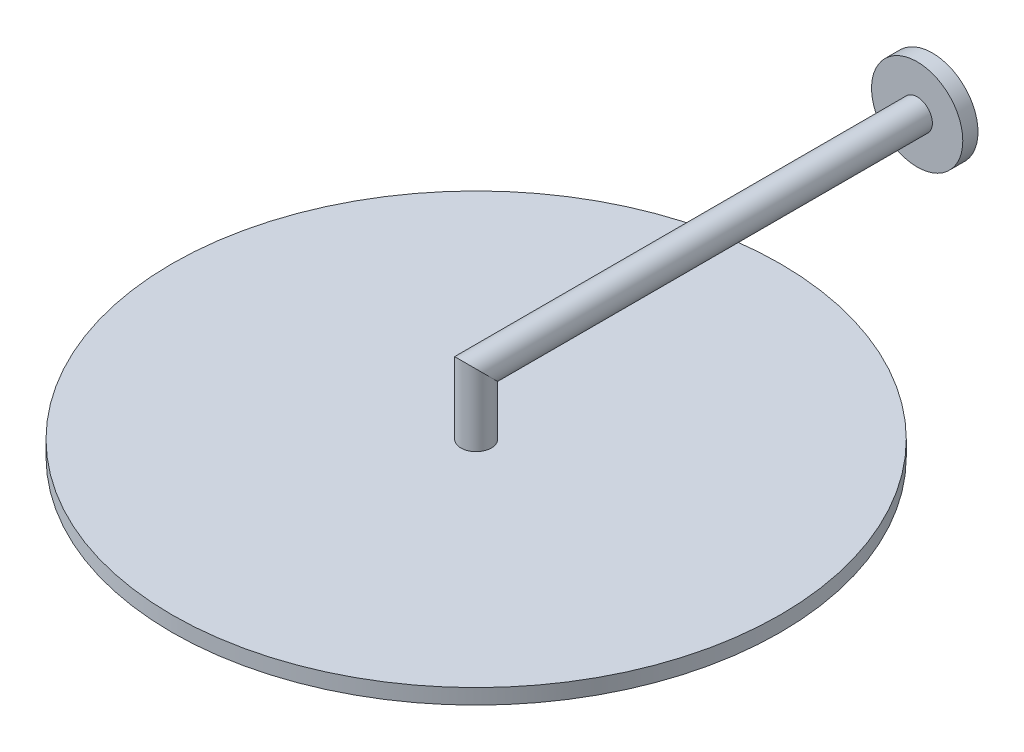
ISO-10303-21;
HEADER;
FILE_DESCRIPTION(('STEP AP214'),'2;1');
FILE_NAME('part.step','',(''),(''),'','','');
FILE_SCHEMA(('AUTOMOTIVE_DESIGN { 1 0 10303 214 1 1 1 1 }'));
ENDSEC;
DATA;
#1=APPLICATION_CONTEXT('core data for automotive mechanical design processes');
#2=APPLICATION_PROTOCOL_DEFINITION('international standard','automotive_design',2000,#1);
#3=PRODUCT_CONTEXT('',#1,'mechanical');
#4=PRODUCT('Part','Part','',(#3));
#5=PRODUCT_RELATED_PRODUCT_CATEGORY('part','',(#4));
#6=PRODUCT_DEFINITION_FORMATION('','',#4);
#7=PRODUCT_DEFINITION_CONTEXT('part definition',#1,'design');
#8=PRODUCT_DEFINITION('design','',#6,#7);
#9=PRODUCT_DEFINITION_SHAPE('','',#8);
#10=(LENGTH_UNIT() NAMED_UNIT(*) SI_UNIT(.MILLI.,.METRE.));
#11=(NAMED_UNIT(*) PLANE_ANGLE_UNIT() SI_UNIT($,.RADIAN.));
#12=(NAMED_UNIT(*) SI_UNIT($,.STERADIAN.) SOLID_ANGLE_UNIT());
#13=UNCERTAINTY_MEASURE_WITH_UNIT(LENGTH_MEASURE(1.E-05),#10,'distance_accuracy_value','');
#14=(GEOMETRIC_REPRESENTATION_CONTEXT(3) GLOBAL_UNCERTAINTY_ASSIGNED_CONTEXT((#13)) GLOBAL_UNIT_ASSIGNED_CONTEXT((#10,
#11,#12)) REPRESENTATION_CONTEXT('',''));
#15=CARTESIAN_POINT('',(0.,0.,0.));
#16=DIRECTION('',(0.,0.,1.));
#17=DIRECTION('',(1.,0.,0.));
#18=AXIS2_PLACEMENT_3D('',#15,#16,#17);
#19=CARTESIAN_POINT('',(0.,0.,10.));
#20=DIRECTION('',(0.,0.,-1.));
#21=DIRECTION('',(-1.,0.,0.));
#22=AXIS2_PLACEMENT_3D('',#19,#20,#21);
#23=CYLINDRICAL_SURFACE('',#22,30.);
#24=CARTESIAN_POINT('',(0.,0.,10.));
#25=DIRECTION('',(0.,0.,1.));
#26=DIRECTION('',(1.,0.,0.));
#27=AXIS2_PLACEMENT_3D('',#24,#25,#26);
#28=CIRCLE('',#27,30.);
#29=CARTESIAN_POINT('',(30.,0.,10.));
#30=VERTEX_POINT('',#29);
#31=EDGE_CURVE('E11',#30,#30,#28,.T.);
#32=ORIENTED_EDGE('',*,*,#31,.F.);
#33=EDGE_LOOP('',(#32));
#34=FACE_BOUND('',#33,.T.);
#35=CARTESIAN_POINT('',(0.,0.,0.));
#36=DIRECTION('',(0.,0.,1.));
#37=DIRECTION('',(1.,0.,0.));
#38=AXIS2_PLACEMENT_3D('',#35,#36,#37);
#39=CIRCLE('',#38,30.);
#40=CARTESIAN_POINT('',(30.,0.,0.));
#41=VERTEX_POINT('',#40);
#42=EDGE_CURVE('E43',#41,#41,#39,.T.);
#43=ORIENTED_EDGE('',*,*,#42,.T.);
#44=EDGE_LOOP('',(#43));
#45=FACE_BOUND('',#44,.T.);
#46=ADVANCED_FACE('F40',(#34,#45),#23,.T.);
#47=CARTESIAN_POINT('',(0.,0.,10.));
#48=DIRECTION('',(0.,0.,1.));
#49=DIRECTION('',(1.,0.,0.));
#50=AXIS2_PLACEMENT_3D('',#47,#48,#49);
#51=PLANE('',#50);
#52=CARTESIAN_POINT('',(0.,0.,10.));
#53=DIRECTION('',(0.,0.,1.));
#54=DIRECTION('',(1.,0.,0.));
#55=AXIS2_PLACEMENT_3D('',#52,#53,#54);
#56=CIRCLE('',#55,10.);
#57=CARTESIAN_POINT('',(10.,0.,10.));
#58=VERTEX_POINT('',#57);
#59=EDGE_CURVE('E50',#58,#58,#56,.F.);
#60=ORIENTED_EDGE('',*,*,#59,.T.);
#61=EDGE_LOOP('',(#60));
#62=FACE_BOUND('',#61,.T.);
#63=ORIENTED_EDGE('',*,*,#31,.T.);
#64=EDGE_LOOP('',(#63));
#65=FACE_BOUND('',#64,.T.);
#66=ADVANCED_FACE('F87',(#62,#65),#51,.T.);
#67=CARTESIAN_POINT('',(0.,0.,0.));
#68=DIRECTION('',(0.,0.,1.));
#69=DIRECTION('',(1.,0.,0.));
#70=AXIS2_PLACEMENT_3D('',#67,#68,#69);
#71=PLANE('',#70);
#72=ORIENTED_EDGE('',*,*,#42,.F.);
#73=EDGE_LOOP('',(#72));
#74=FACE_BOUND('',#73,.T.);
#75=ADVANCED_FACE('F92',(#74),#71,.F.);
#76=CARTESIAN_POINT('',(0.,11.1,300.));
#77=DIRECTION('',(0.,-1.,0.));
#78=DIRECTION('',(0.,0.,-1.));
#79=AXIS2_PLACEMENT_3D('',#76,#77,#78);
#80=CYLINDRICAL_SURFACE('',#79,10.);
#81=CARTESIAN_POINT('',(0.,0.,300.));
#82=DIRECTION('',(0.,-0.707106781186548,0.707106781186548));
#83=DIRECTION('',(0.,0.707106781186548,0.707106781186548));
#84=AXIS2_PLACEMENT_3D('',#81,#82,#83);
#85=ELLIPSE('',#84,14.1421356237309,10.);
#86=CARTESIAN_POINT('',(0.,10.,310.));
#87=VERTEX_POINT('',#86);
#88=EDGE_CURVE('E54',#87,#87,#85,.T.);
#89=ORIENTED_EDGE('',*,*,#88,.T.);
#90=EDGE_LOOP('',(#89));
#91=FACE_BOUND('',#90,.T.);
#92=CARTESIAN_POINT('',(0.,-40.,300.));
#93=DIRECTION('',(0.,1.,0.));
#94=DIRECTION('',(0.,0.,1.));
#95=AXIS2_PLACEMENT_3D('',#92,#93,#94);
#96=CIRCLE('',#95,10.);
#97=CARTESIAN_POINT('',(0.,-40.,310.));
#98=VERTEX_POINT('',#97);
#99=EDGE_CURVE('E55',#98,#98,#96,.T.);
#100=ORIENTED_EDGE('',*,*,#99,.T.);
#101=EDGE_LOOP('',(#100));
#102=FACE_BOUND('',#101,.T.);
#103=ADVANCED_FACE('F74',(#91,#102),#80,.T.);
#104=CARTESIAN_POINT('',(0.,0.,0.));
#105=DIRECTION('',(0.,0.,1.));
#106=DIRECTION('',(1.,0.,0.));
#107=AXIS2_PLACEMENT_3D('',#104,#105,#106);
#108=CYLINDRICAL_SURFACE('',#107,10.);
#109=ORIENTED_EDGE('',*,*,#59,.F.);
#110=EDGE_LOOP('',(#109));
#111=FACE_BOUND('',#110,.T.);
#112=ORIENTED_EDGE('',*,*,#88,.F.);
#113=EDGE_LOOP('',(#112));
#114=FACE_BOUND('',#113,.T.);
#115=ADVANCED_FACE('F72',(#111,#114),#108,.T.);
#116=CARTESIAN_POINT('',(0.,-50.,300.));
#117=DIRECTION('',(0.,1.,0.));
#118=DIRECTION('',(0.,0.,1.));
#119=AXIS2_PLACEMENT_3D('',#116,#117,#118);
#120=CYLINDRICAL_SURFACE('',#119,200.);
#121=CARTESIAN_POINT('',(0.,-50.,300.));
#122=DIRECTION('',(0.,-1.,0.));
#123=DIRECTION('',(0.,0.,-1.));
#124=AXIS2_PLACEMENT_3D('',#121,#122,#123);
#125=CIRCLE('',#124,200.);
#126=CARTESIAN_POINT('',(0.,-50.,100.));
#127=VERTEX_POINT('',#126);
#128=EDGE_CURVE('E58',#127,#127,#125,.T.);
#129=ORIENTED_EDGE('',*,*,#128,.F.);
#130=EDGE_LOOP('',(#129));
#131=FACE_BOUND('',#130,.T.);
#132=CARTESIAN_POINT('',(0.,-40.,300.));
#133=DIRECTION('',(0.,-1.,0.));
#134=DIRECTION('',(0.,0.,-1.));
#135=AXIS2_PLACEMENT_3D('',#132,#133,#134);
#136=CIRCLE('',#135,200.);
#137=CARTESIAN_POINT('',(0.,-40.,100.));
#138=VERTEX_POINT('',#137);
#139=EDGE_CURVE('E61',#138,#138,#136,.T.);
#140=ORIENTED_EDGE('',*,*,#139,.T.);
#141=EDGE_LOOP('',(#140));
#142=FACE_BOUND('',#141,.T.);
#143=ADVANCED_FACE('F69',(#131,#142),#120,.T.);
#144=CARTESIAN_POINT('',(0.,-50.,300.));
#145=DIRECTION('',(0.,-1.,0.));
#146=DIRECTION('',(0.,0.,-1.));
#147=AXIS2_PLACEMENT_3D('',#144,#145,#146);
#148=PLANE('',#147);
#149=ORIENTED_EDGE('',*,*,#128,.T.);
#150=EDGE_LOOP('',(#149));
#151=FACE_BOUND('',#150,.T.);
#152=ADVANCED_FACE('F67',(#151),#148,.T.);
#153=CARTESIAN_POINT('',(0.,-40.,300.));
#154=DIRECTION('',(0.,-1.,0.));
#155=DIRECTION('',(0.,0.,-1.));
#156=AXIS2_PLACEMENT_3D('',#153,#154,#155);
#157=PLANE('',#156);
#158=ORIENTED_EDGE('',*,*,#99,.F.);
#159=EDGE_LOOP('',(#158));
#160=FACE_BOUND('',#159,.T.);
#161=ORIENTED_EDGE('',*,*,#139,.F.);
#162=EDGE_LOOP('',(#161));
#163=FACE_BOUND('',#162,.T.);
#164=ADVANCED_FACE('F77',(#160,#163),#157,.F.);
#165=CLOSED_SHELL('',(#46,#66,#75,#103,#115,#143,#152,#164));
#166=MANIFOLD_SOLID_BREP('B2',#165);
#167=ADVANCED_BREP_SHAPE_REPRESENTATION('',(#18,#166),#14);
#168=SHAPE_DEFINITION_REPRESENTATION(#9,#167);
ENDSEC;
END-ISO-10303-21;
